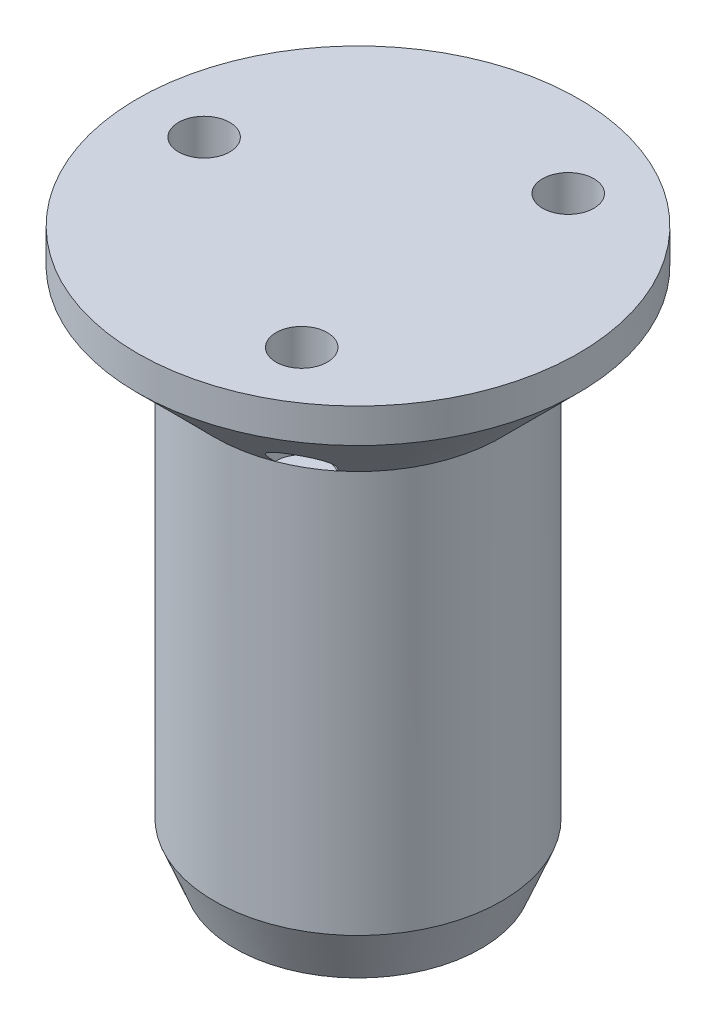
ISO-10303-21;
HEADER;
FILE_DESCRIPTION(('STEP AP214'),'2;1');
FILE_NAME('part.step','',(''),(''),'','','');
FILE_SCHEMA(('AUTOMOTIVE_DESIGN { 1 0 10303 214 1 1 1 1 }'));
ENDSEC;
DATA;
#1=APPLICATION_CONTEXT('core data for automotive mechanical design processes');
#2=APPLICATION_PROTOCOL_DEFINITION('international standard','automotive_design',2000,#1);
#3=PRODUCT_CONTEXT('',#1,'mechanical');
#4=PRODUCT('Part','Part','',(#3));
#5=PRODUCT_RELATED_PRODUCT_CATEGORY('part','',(#4));
#6=PRODUCT_DEFINITION_FORMATION('','',#4);
#7=PRODUCT_DEFINITION_CONTEXT('part definition',#1,'design');
#8=PRODUCT_DEFINITION('design','',#6,#7);
#9=PRODUCT_DEFINITION_SHAPE('','',#8);
#10=(LENGTH_UNIT() NAMED_UNIT(*) SI_UNIT(.MILLI.,.METRE.));
#11=(NAMED_UNIT(*) PLANE_ANGLE_UNIT() SI_UNIT($,.RADIAN.));
#12=(NAMED_UNIT(*) SI_UNIT($,.STERADIAN.) SOLID_ANGLE_UNIT());
#13=UNCERTAINTY_MEASURE_WITH_UNIT(LENGTH_MEASURE(1.E-05),#10,'distance_accuracy_value','');
#14=(GEOMETRIC_REPRESENTATION_CONTEXT(3) GLOBAL_UNCERTAINTY_ASSIGNED_CONTEXT((#13)) GLOBAL_UNIT_ASSIGNED_CONTEXT((#10,
#11,#12)) REPRESENTATION_CONTEXT('',''));
#15=CARTESIAN_POINT('',(0.,0.,0.));
#16=DIRECTION('',(0.,0.,1.));
#17=DIRECTION('',(1.,0.,0.));
#18=AXIS2_PLACEMENT_3D('',#15,#16,#17);
#19=CARTESIAN_POINT('',(0.,-2.,0.));
#20=DIRECTION('',(0.,1.,0.));
#21=DIRECTION('',(0.,0.,1.));
#22=AXIS2_PLACEMENT_3D('',#19,#20,#21);
#23=CYLINDRICAL_SURFACE('',#22,12.9);
#24=CARTESIAN_POINT('',(0.,-2.,0.));
#25=DIRECTION('',(0.,-1.,0.));
#26=DIRECTION('',(0.,0.,-1.));
#27=AXIS2_PLACEMENT_3D('',#24,#25,#26);
#28=CIRCLE('',#27,12.9);
#29=CARTESIAN_POINT('',(0.,-2.,-12.9));
#30=VERTEX_POINT('',#29);
#31=EDGE_CURVE('E104',#30,#30,#28,.T.);
#32=ORIENTED_EDGE('',*,*,#31,.F.);
#33=EDGE_LOOP('',(#32));
#34=FACE_BOUND('',#33,.T.);
#35=CARTESIAN_POINT('',(0.,0.,0.));
#36=DIRECTION('',(0.,1.,0.));
#37=DIRECTION('',(0.,0.,1.));
#38=AXIS2_PLACEMENT_3D('',#35,#36,#37);
#39=CIRCLE('',#38,12.9);
#40=CARTESIAN_POINT('',(0.,0.,12.9));
#41=VERTEX_POINT('',#40);
#42=EDGE_CURVE('E103',#41,#41,#39,.T.);
#43=ORIENTED_EDGE('',*,*,#42,.F.);
#44=EDGE_LOOP('',(#43));
#45=FACE_BOUND('',#44,.T.);
#46=ADVANCED_FACE('F32',(#34,#45),#23,.T.);
#47=CARTESIAN_POINT('',(0.,0.,0.));
#48=DIRECTION('',(0.,1.,0.));
#49=DIRECTION('',(0.,0.,1.));
#50=AXIS2_PLACEMENT_3D('',#47,#48,#49);
#51=PLANE('',#50);
#52=CARTESIAN_POINT('',(-9.,0.,0.));
#53=DIRECTION('',(0.,1.,0.));
#54=DIRECTION('',(0.,0.,1.));
#55=AXIS2_PLACEMENT_3D('',#52,#53,#54);
#56=CIRCLE('',#55,1.5);
#57=CARTESIAN_POINT('',(-9.,0.,1.5));
#58=VERTEX_POINT('',#57);
#59=EDGE_CURVE('E188',#58,#58,#56,.T.);
#60=ORIENTED_EDGE('',*,*,#59,.F.);
#61=EDGE_LOOP('',(#60));
#62=FACE_BOUND('',#61,.T.);
#63=CARTESIAN_POINT('',(4.50000000000003,0.,-7.79422863405993));
#64=DIRECTION('',(0.,1.,0.));
#65=DIRECTION('',(0.,0.,1.));
#66=AXIS2_PLACEMENT_3D('',#63,#64,#65);
#67=CIRCLE('',#66,1.5);
#68=CARTESIAN_POINT('',(4.50000000000003,0.,-6.29422863405993));
#69=VERTEX_POINT('',#68);
#70=EDGE_CURVE('E192',#69,#69,#67,.T.);
#71=ORIENTED_EDGE('',*,*,#70,.F.);
#72=EDGE_LOOP('',(#71));
#73=FACE_BOUND('',#72,.T.);
#74=CARTESIAN_POINT('',(4.50000000000004,0.,7.79422863405993));
#75=DIRECTION('',(0.,1.,0.));
#76=DIRECTION('',(0.,0.,1.));
#77=AXIS2_PLACEMENT_3D('',#74,#75,#76);
#78=CIRCLE('',#77,1.5);
#79=CARTESIAN_POINT('',(4.50000000000004,0.,9.29422863405992));
#80=VERTEX_POINT('',#79);
#81=EDGE_CURVE('E160',#80,#80,#78,.T.);
#82=ORIENTED_EDGE('',*,*,#81,.F.);
#83=EDGE_LOOP('',(#82));
#84=FACE_BOUND('',#83,.T.);
#85=ORIENTED_EDGE('',*,*,#42,.T.);
#86=EDGE_LOOP('',(#85));
#87=FACE_BOUND('',#86,.T.);
#88=ADVANCED_FACE('F177',(#62,#73,#84,#87),#51,.T.);
#89=CARTESIAN_POINT('',(0.,-2.,0.));
#90=DIRECTION('',(0.,1.,0.));
#91=DIRECTION('',(0.,0.,-1.));
#92=AXIS2_PLACEMENT_3D('',#89,#90,#91);
#93=CONICAL_SURFACE('',#92,12.9,0.78539816339745);
#94=CARTESIAN_POINT('',(0.,-6.5,0.));
#95=DIRECTION('',(0.,-1.,0.));
#96=DIRECTION('',(0.,0.,-1.));
#97=AXIS2_PLACEMENT_3D('',#94,#95,#96);
#98=CIRCLE('',#97,8.39999999999998);
#99=CARTESIAN_POINT('',(-8.29499999999998,-6.5,-1.32399962235643));
#100=VERTEX_POINT('',#99);
#101=CARTESIAN_POINT('',(3.00088269243835,-6.5,-7.8456805355701));
#102=VERTEX_POINT('',#101);
#103=EDGE_CURVE('E54',#100,#102,#98,.T.);
#104=ORIENTED_EDGE('',*,*,#103,.F.);
#105=CARTESIAN_POINT('',(-8.2948133355556,-6.50019999999994,-1.32390021085042));
#106=CARTESIAN_POINT('',(-8.34738668669859,-6.44386357180026,-1.35187811690227));
#107=CARTESIAN_POINT('',(-8.40106659626324,-6.38692104483049,-1.37647841384716));
#108=CARTESIAN_POINT('',(-8.51022908291239,-6.27229004671864,-1.41900417487351));
#109=CARTESIAN_POINT('',(-8.56571137647042,-6.21460169375106,-1.43693068330926));
#110=CARTESIAN_POINT('',(-8.6785090940311,-6.09849071165192,-1.46630844133853));
#111=CARTESIAN_POINT('',(-8.73583519535531,-6.04006582709039,-1.47770978211809));
#112=CARTESIAN_POINT('',(-8.85151275248889,-5.923327822058,-1.49377440670635));
#113=CARTESIAN_POINT('',(-8.90986427089606,-5.86501470865302,-1.49843727770076));
#114=CARTESIAN_POINT('',(-9.0863525365759,-5.69033756014666,-1.50214528840881));
#115=CARTESIAN_POINT('',(-9.2055447986388,-5.5746248501253,-1.49081099676006));
#116=CARTESIAN_POINT('',(-9.44232768546468,-5.34884448984281,-1.43839734316387));
#117=CARTESIAN_POINT('',(-9.55992231221007,-5.23875938345641,-1.39741679838285));
#118=CARTESIAN_POINT('',(-9.74779373160093,-5.0656232408859,-1.30293484555109));
#119=CARTESIAN_POINT('',(-9.82016438487202,-4.99964895860739,-1.2589085992467));
#120=CARTESIAN_POINT('',(-9.95957168287049,-4.87372316547325,-1.15615652962756));
#121=CARTESIAN_POINT('',(-10.026615557982,-4.81376346055842,-1.09745109657414));
#122=CARTESIAN_POINT('',(-10.1388823463932,-4.7141360859582,-0.978841720222277));
#123=CARTESIAN_POINT('',(-10.1857194662718,-4.67286026020672,-0.921824848308756));
#124=CARTESIAN_POINT('',(-10.2720730434249,-4.59714874235353,-0.7984239763528));
#125=CARTESIAN_POINT('',(-10.3115977041597,-4.56270538209891,-0.732050622016499));
#126=CARTESIAN_POINT('',(-10.3751342759961,-4.5075484751139,-0.602732589157478));
#127=CARTESIAN_POINT('',(-10.4006379141513,-4.48549935724348,-0.541094864489285));
#128=CARTESIAN_POINT('',(-10.4435857126607,-4.44845045202638,-0.413049763226484));
#129=CARTESIAN_POINT('',(-10.4610342359217,-4.43344684852883,-0.346644991191945));
#130=CARTESIAN_POINT('',(-10.4867882540994,-4.41132445613313,-0.210439068089613));
#131=CARTESIAN_POINT('',(-10.4950491351605,-4.40424414055211,-0.140623048061385));
#132=CARTESIAN_POINT('',(-10.5016447351282,-4.39858987616998,-0.000181248439347318));
#133=CARTESIAN_POINT('',(-10.499981789073,-4.40001392632459,0.0704443367636769));
#134=CARTESIAN_POINT('',(-10.4874154160623,-4.41079122923776,0.204309964785347));
#135=CARTESIAN_POINT('',(-10.4772837014413,-4.41948229989263,0.267679489268534));
#136=CARTESIAN_POINT('',(-10.4494211826802,-4.44343634124517,0.391409671325698));
#137=CARTESIAN_POINT('',(-10.4316899400441,-4.45869969116632,0.451770155052387));
#138=CARTESIAN_POINT('',(-10.3887262565994,-4.4957975947438,0.570608934440158));
#139=CARTESIAN_POINT('',(-10.3632175961048,-4.51787457014285,0.628910310152743));
#140=CARTESIAN_POINT('',(-10.3062348784891,-4.56738939276832,0.740039467923688));
#141=CARTESIAN_POINT('',(-10.2747573363883,-4.59483037210204,0.792864024287268));
#142=CARTESIAN_POINT('',(-10.192054935609,-4.66726794191557,0.914631658954378));
#143=CARTESIAN_POINT('',(-10.1382457856195,-4.71466774160586,0.980400168020199));
#144=CARTESIAN_POINT('',(-10.0237520822674,-4.81634305587925,1.09944725894165));
#145=CARTESIAN_POINT('',(-9.96305445557763,-4.87063166828094,1.15270148216723));
#146=CARTESIAN_POINT('',(-9.81674870613006,-5.00267168786804,1.26244861815542));
#147=CARTESIAN_POINT('',(-9.72944597149449,-5.08232230583112,1.31439049611742));
#148=CARTESIAN_POINT('',(-9.55092248117969,-5.2473601728877,1.39866252502382));
#149=CARTESIAN_POINT('',(-9.45969564429455,-5.33275645072566,1.43096096922569));
#150=CARTESIAN_POINT('',(-9.25268077871972,-5.52929146548514,1.48333169716938));
#151=CARTESIAN_POINT('',(-9.13654930835942,-5.64145165711855,1.49820228434191));
#152=CARTESIAN_POINT('',(-8.90631448681981,-5.8680290330749,1.50149148243465));
#153=CARTESIAN_POINT('',(-8.79221051249085,-5.98244550029744,1.48991836765634));
#154=CARTESIAN_POINT('',(-8.61405335879825,-6.16457748121705,1.45110057353249));
#155=CARTESIAN_POINT('',(-8.5483635483597,-6.23252868831872,1.43205250032285));
#156=CARTESIAN_POINT('',(-8.41956184430871,-6.36731683688022,1.38482914670905));
#157=CARTESIAN_POINT('',(-8.35644345026977,-6.43415629785294,1.3566787272371));
#158=CARTESIAN_POINT('',(-8.2948133355556,-6.50019999999994,1.32390021085042));
#159=B_SPLINE_CURVE_WITH_KNOTS('',3,(#105,#106,#107,#108,#109,#110,#111,#112,#113,#114,#115,
#116,#117,#118,#119,#120,#121,#122,#123,#124,#125,#126,#127,#128,#129,#130,#131,#132,#133,#134,
#135,#136,#137,#138,#139,#140,#141,#142,#143,#144,#145,#146,#147,#148,#149,#150,#151,#152,#153,
#154,#155,#156,#157,#158),.UNSPECIFIED.,.F.,.F.,(4,2,2,2,2,2,2,2,2,2,2,2,2,2,2,2,2,2,2,2,2,2,2,
2,2,2,4),(0.,0.245816724847092,0.491594966640196,0.739228788759014,0.986877780856484,
1.48381023270232,1.97909389195951,2.30015547920576,2.62077354651965,2.87348783389669,
3.12591687224672,3.33580899390305,3.54558729753524,3.75637986609703,3.96712283793918,
4.16052261255165,4.35393354791435,4.55522564985438,4.75663564171412,5.04692996451224,
5.33778473962407,5.72296900584317,6.10877336465988,6.59274017297387,7.0765555675835,
7.36536650428924,7.65339519171124),.UNSPECIFIED.);
#160=CARTESIAN_POINT('',(-8.29499999999998,-6.5,1.32399962235643));
#161=VERTEX_POINT('',#160);
#162=EDGE_CURVE('E84',#100,#161,#159,.T.);
#163=ORIENTED_EDGE('',*,*,#162,.T.);
#164=CARTESIAN_POINT('',(3.00088269243836,-6.5,7.8456805355701));
#165=VERTEX_POINT('',#164);
#166=EDGE_CURVE('E100',#165,#161,#98,.T.);
#167=ORIENTED_EDGE('',*,*,#166,.F.);
#168=CARTESIAN_POINT('',(3.0008754531058,-6.5002,7.84546917366621));
#169=CARTESIAN_POINT('',(3.00293255129169,-6.44386357180032,7.90498798434405));
#170=CARTESIAN_POINT('',(3.00846802397911,-6.38692104483055,7.96377629817233));
#171=CARTESIAN_POINT('',(3.02622087793959,-6.27229004671871,8.07957666526395));
#172=CARTESIAN_POINT('',(3.03843721301208,-6.21460169375113,8.1365889951633));
#173=CARTESIAN_POINT('',(3.06939418703284,-6.09849071165199,8.24896356307439));
#174=CARTESIAN_POINT('',(3.08818338694264,-6.04006582709046,8.30431009351086));
#175=CARTESIAN_POINT('',(3.13210979251373,-5.92332782205807,8.41252210893039));
#176=CARTESIAN_POINT('',(3.15724738698158,-5.86501470865309,8.46538744171761));
#177=CARTESIAN_POINT('',(3.24228028835082,-5.69033756014673,8.62008476862023));
#178=CARTESIAN_POINT('',(3.31169220388398,-5.57462485012537,8.71764114967685));
#179=CARTESIAN_POINT('',(3.47547520281637,-5.34884448984288,8.8964943180514));
#180=CARTESIAN_POINT('',(3.56976270903034,-5.23875938345648,8.97784397977095));
#181=CARTESIAN_POINT('',(3.74552219007724,-5.06562324088597,9.0933044251926));
#182=CARTESIAN_POINT('',(3.81983536444566,-4.99964895860745,9.13396612626165));
#183=CARTESIAN_POINT('',(3.97852491602649,-4.87372316547331,9.20332035299171));
#184=CARTESIAN_POINT('',(4.06288724994671,-4.81376346055847,9.23202933547977));
#185=CARTESIAN_POINT('',(4.22173937720003,-4.71413608595824,9.2699505380692));
#186=CARTESIAN_POINT('',(4.29453599666076,-4.67286026020676,9.28200423776741));
#187=CARTESIAN_POINT('',(4.44458107520031,-4.59714874235356,9.29508819331166));
#188=CARTESIAN_POINT('',(4.52182441655732,-4.56270538209894,9.29613087641579));
#189=CARTESIAN_POINT('',(4.66558540409891,-4.50754847511392,9.28649614526605));
#190=CARTESIAN_POINT('',(4.73171705857059,-4.4854993572435,9.27776408146322));
#191=CARTESIAN_POINT('',(4.86408126834904,-4.44845045202639,9.25093541537759));
#192=CARTESIAN_POINT('',(4.93031374949399,-4.43344684852885,9.2328438937629));
#193=CARTESIAN_POINT('',(5.06114854813536,-4.41132445613314,9.18704456620313));
#194=CARTESIAN_POINT('',(5.12574143560146,-4.40424414055211,9.15929068904555));
#195=CARTESIAN_POINT('',(5.25066540181124,-4.39858987616998,9.09478174635982));
#196=CARTESIAN_POINT('',(5.31099747972661,-4.40001392632459,9.05802880022939));
#197=CARTESIAN_POINT('',(5.42064532778157,-4.41079122923775,8.98021318795783));
#198=CARTESIAN_POINT('',(5.47045908849924,-4.41948229989262,8.93975410347055));
#199=CARTESIAN_POINT('',(5.56368130999506,-4.44343634124515,8.85375936338142));
#200=CARTESIAN_POINT('',(5.60708940096908,-4.45869969116631,8.8082234149546));
#201=CARTESIAN_POINT('',(5.68852496115128,-4.49579759474378,8.71159638395747));
#202=CARTESIAN_POINT('',(5.72626110334665,-4.51787457014284,8.66035454809631));
#203=CARTESIAN_POINT('',(5.79401041826962,-4.5673893927683,8.555441488179));
#204=CARTESIAN_POINT('',(5.82401905497372,-4.59483037210202,8.5017688588892));
#205=CARTESIAN_POINT('',(5.8881217195645,-4.66726794191555,8.36926266152676));
#206=CARTESIAN_POINT('',(5.91817434418979,-4.71466774160583,8.28977831614691));
#207=CARTESIAN_POINT('',(5.96402529749839,-4.81634305587921,8.13110031500996));
#208=CARTESIAN_POINT('',(5.97979599432564,-4.8706316682809,8.05190751673438));
#209=CARTESIAN_POINT('',(6.00168692736022,-5.002671687868,7.87032945299897));
#210=CARTESIAN_POINT('',(6.0030185458778,-5.08232230583107,7.76875212800371));
#211=CARTESIAN_POINT('',(5.98673851858181,-5.24736017288764,7.57201023576564));
#212=CARTESIAN_POINT('',(5.96909637332077,-5.3327564507256,7.47685625541527));
#213=CARTESIAN_POINT('',(5.91094332134729,-5.52929146548507,7.27139075889461));
#214=CARTESIAN_POINT('',(5.86575589242775,-5.64145165711848,7.16338266179748));
#215=CARTESIAN_POINT('',(5.75348701076434,-5.86802903307483,6.96234885846202));
#216=CARTESIAN_POINT('',(5.68641241220093,-5.98244550029736,6.86931847540953));
#217=CARTESIAN_POINT('',(5.5637166395245,-6.164577481217,6.73443875150772));
#218=CARTESIAN_POINT('',(5.51437561901251,-6.23252868831869,6.68707374350295));
#219=CARTESIAN_POINT('',(5.40907814310554,-6.36731683688024,6.59913987255094));
#220=CARTESIAN_POINT('',(5.35313996769615,-6.43415629785298,6.5585529496031));
#221=CARTESIAN_POINT('',(5.29393788244981,-6.5002,6.52156896281581));
#222=B_SPLINE_CURVE_WITH_KNOTS('',3,(#168,#169,#170,#171,#172,#173,#174,#175,#176,#177,#178,
#179,#180,#181,#182,#183,#184,#185,#186,#187,#188,#189,#190,#191,#192,#193,#194,#195,#196,#197,
#198,#199,#200,#201,#202,#203,#204,#205,#206,#207,#208,#209,#210,#211,#212,#213,#214,#215,#216,
#217,#218,#219,#220,#221),.UNSPECIFIED.,.F.,.F.,(4,2,2,2,2,2,2,2,2,2,2,2,2,2,2,2,2,2,2,2,2,2,2,
2,2,2,4),(0.,0.245816724847091,0.491594966640191,0.739228788759006,0.986877780856472,
1.48381023270231,1.97909389195949,2.30015547920575,2.62077354651966,2.8734878338967,
3.12591687224675,3.33580899390308,3.54558729753528,3.75637986609707,3.96712283793922,
4.16052261255169,4.35393354791439,4.55522564985442,4.75663564171416,5.04692996451228,
5.3377847396241,5.72296900584318,6.10877336465988,6.59274017297386,7.07655556758349,
7.36536650428933,7.65339519171143),.UNSPECIFIED.);
#223=CARTESIAN_POINT('',(5.2941173075617,-6.5,6.52168091321366));
#224=VERTEX_POINT('',#223);
#225=EDGE_CURVE('E110',#165,#224,#222,.T.);
#226=ORIENTED_EDGE('',*,*,#225,.T.);
#227=CARTESIAN_POINT('',(5.29411730756169,-6.5,-6.52168091321366));
#228=VERTEX_POINT('',#227);
#229=EDGE_CURVE('E101',#228,#224,#98,.T.);
#230=ORIENTED_EDGE('',*,*,#229,.F.);
#231=CARTESIAN_POINT('',(5.29393788244981,-6.5002,-6.52156896281582));
#232=CARTESIAN_POINT('',(5.34445413540691,-6.44386357180032,-6.5531098674418));
#233=CARTESIAN_POINT('',(5.39259857228414,-6.38692104483055,-6.58729788432519));
#234=CARTESIAN_POINT('',(5.48400820497281,-6.27229004671871,-6.66057249039045));
#235=CARTESIAN_POINT('',(5.52727416345834,-6.21460169375112,-6.69965831185405));
#236=CARTESIAN_POINT('',(5.60911490699826,-6.09849071165198,-6.78265512173587));
#237=CARTESIAN_POINT('',(5.64765180841268,-6.04006582709046,-6.82660031139277));
#238=CARTESIAN_POINT('',(5.71940295997516,-5.92332782205807,-6.91874770222404));
#239=CARTESIAN_POINT('',(5.75261688391448,-5.86501470865309,-6.96695016401684));
#240=CARTESIAN_POINT('',(5.84407224822508,-5.69033756014673,-7.11793948021141));
#241=CARTESIAN_POINT('',(5.89385259475482,-5.57462485012537,-7.22683015291678));
#242=CARTESIAN_POINT('',(5.96685248264831,-5.34884448984288,-7.4580969748875));
#243=CARTESIAN_POINT('',(5.99015960317973,-5.23875938345648,-7.58042718138806));
#244=CARTESIAN_POINT('',(6.0022715415237,-5.06562324088596,-7.79036957964146));
#245=CARTESIAN_POINT('',(6.00032902042638,-4.99964895860744,-7.8750575270149));
#246=CARTESIAN_POINT('',(5.98104676684402,-4.8737231654733,-8.0471638233641));
#247=CARTESIAN_POINT('',(5.96372830803537,-4.81376346055847,-8.13457823890558));
#248=CARTESIAN_POINT('',(5.91714296919321,-4.71413608595824,-8.29110881784687));
#249=CARTESIAN_POINT('',(5.89118346961109,-4.67286026020676,-8.3601793894586));
#250=CARTESIAN_POINT('',(5.82749196822462,-4.59714874235356,-8.4966642169588));
#251=CARTESIAN_POINT('',(5.78977328760239,-4.56270538209894,-8.56408025439923));
#252=CARTESIAN_POINT('',(5.70954887189729,-4.50754847511392,-8.68376355610851));
#253=CARTESIAN_POINT('',(5.66892085558073,-4.4854993572435,-8.73666921697387));
#254=CARTESIAN_POINT('',(5.5795044443117,-4.44845045202639,-8.83788565215104));
#255=CARTESIAN_POINT('',(5.5307204864278,-4.43344684852885,-8.8861989025709));
#256=CARTESIAN_POINT('',(5.42563970596411,-4.41132445613314,-8.97660549811346));
#257=CARTESIAN_POINT('',(5.36930769955908,-4.40424414055211,-9.01866764098411));
#258=CARTESIAN_POINT('',(5.25097933331707,-4.39858987616998,-9.09460049792042));
#259=CARTESIAN_POINT('',(5.18898430934652,-4.40001392632459,-9.12847313699302));
#260=CARTESIAN_POINT('',(5.06677008828083,-4.41079122923775,-9.18452315274313));
#261=CARTESIAN_POINT('',(5.00682461294214,-4.41948229989262,-9.20743359273904));
#262=CARTESIAN_POINT('',(4.8857398726852,-4.44343634124515,-9.24516903470707));
#263=CARTESIAN_POINT('',(4.82460053907515,-4.45869969116631,-9.25999357000694));
#264=CARTESIAN_POINT('',(4.70020129544827,-4.49579759474378,-9.28220531839759));
#265=CARTESIAN_POINT('',(4.63695649275827,-4.51787457014284,-9.28926485824901));
#266=CARTESIAN_POINT('',(4.51222446021963,-4.5673893927683,-9.29548095610265));
#267=CARTESIAN_POINT('',(4.45073828141472,-4.59483037210202,-9.29463288317644));
#268=CARTESIAN_POINT('',(4.30393321604458,-4.66726794191555,-9.28389432048111));
#269=CARTESIAN_POINT('',(4.22007144142981,-4.71466774160583,-9.27017848416708));
#270=CARTESIAN_POINT('',(4.05972678476918,-4.81634305587921,-9.2305475739516));
#271=CARTESIAN_POINT('',(3.98325846125212,-4.8706316682809,-9.20460899890158));
#272=CARTESIAN_POINT('',(3.81506177876997,-5.00267168786799,-9.13277807115437));
#273=CARTESIAN_POINT('',(3.72642742561682,-5.08232230583107,-9.08314262412112));
#274=CARTESIAN_POINT('',(3.56418396259803,-5.24736017288764,-8.97067276078945));
#275=CARTESIAN_POINT('',(3.49059927097392,-5.3327564507256,-8.90781722464096));
#276=CARTESIAN_POINT('',(3.34173745737258,-5.52929146548506,-8.754722456064));
#277=CARTESIAN_POINT('',(3.27079341593182,-5.64145165711848,-8.66158494613941));
#278=CARTESIAN_POINT('',(3.15282747605561,-5.86802903307482,-8.4638403408967));
#279=CARTESIAN_POINT('',(3.10579810029006,-5.98244550029735,-8.3592368430659));
#280=CARTESIAN_POINT('',(3.05033671927387,-6.16457748121699,-8.18553932504025));
#281=CARTESIAN_POINT('',(3.03398792934729,-6.23252868831868,-8.11912624382583));
#282=CARTESIAN_POINT('',(3.01048370120322,-6.36731683688024,-7.98396901926));
#283=CARTESIAN_POINT('',(3.00330348257365,-6.43415629785297,-7.9152316768402));
#284=CARTESIAN_POINT('',(3.0008754531058,-6.5002,-7.84546917366621));
#285=B_SPLINE_CURVE_WITH_KNOTS('',3,(#231,#232,#233,#234,#235,#236,#237,#238,#239,#240,#241,
#242,#243,#244,#245,#246,#247,#248,#249,#250,#251,#252,#253,#254,#255,#256,#257,#258,#259,#260,
#261,#262,#263,#264,#265,#266,#267,#268,#269,#270,#271,#272,#273,#274,#275,#276,#277,#278,#279,
#280,#281,#282,#283,#284),.UNSPECIFIED.,.F.,.F.,(4,2,2,2,2,2,2,2,2,2,2,2,2,2,2,2,2,2,2,2,2,2,2,
2,2,2,4),(0.,0.24581672484709,0.491594966640191,0.739228788759005,0.986877780856474,
1.48381023270231,1.97909389195949,2.30015547920575,2.62077354651966,2.8734878338967,
3.12591687224675,3.33580899390308,3.54558729753528,3.75637986609707,3.96712283793922,
4.16052261255169,4.35393354791439,4.55522564985442,4.75663564171415,5.04692996451227,
5.33778473962409,5.72296900584317,6.10877336465986,6.59274017297385,7.07655556758347,
7.36536650428932,7.65339519171142),.UNSPECIFIED.);
#286=EDGE_CURVE('E99',#228,#102,#285,.T.);
#287=ORIENTED_EDGE('',*,*,#286,.T.);
#288=EDGE_LOOP('',(#104,#163,#167,#226,#230,#287));
#289=FACE_BOUND('',#288,.T.);
#290=ORIENTED_EDGE('',*,*,#31,.T.);
#291=EDGE_LOOP('',(#290));
#292=FACE_BOUND('',#291,.T.);
#293=ADVANCED_FACE('F96',(#289,#292),#93,.T.);
#294=CARTESIAN_POINT('',(0.,-30.,0.));
#295=DIRECTION('',(0.,1.,0.));
#296=DIRECTION('',(0.,0.,1.));
#297=AXIS2_PLACEMENT_3D('',#294,#295,#296);
#298=CYLINDRICAL_SURFACE('',#297,8.39999999999998);
#299=CARTESIAN_POINT('',(0.,-30.,0.));
#300=DIRECTION('',(0.,-1.,0.));
#301=DIRECTION('',(0.,0.,-1.));
#302=AXIS2_PLACEMENT_3D('',#299,#300,#301);
#303=CIRCLE('',#302,8.39999999999998);
#304=CARTESIAN_POINT('',(0.,-30.,-8.39999999999998));
#305=VERTEX_POINT('',#304);
#306=EDGE_CURVE('E163',#305,#305,#303,.T.);
#307=ORIENTED_EDGE('',*,*,#306,.F.);
#308=EDGE_LOOP('',(#307));
#309=FACE_BOUND('',#308,.T.);
#310=ORIENTED_EDGE('',*,*,#166,.T.);
#311=DIRECTION('',(0.,1.,0.));
#312=VECTOR('',#311,1.);
#313=CARTESIAN_POINT('',(-8.29499999999998,-3.2505,1.32399962235643));
#314=LINE('',#313,#312);
#315=CARTESIAN_POINT('',(-8.29499999999998,-6.501,1.32399962235643));
#316=VERTEX_POINT('',#315);
#317=EDGE_CURVE('E11',#161,#316,#314,.F.);
#318=ORIENTED_EDGE('',*,*,#317,.T.);
#319=CARTESIAN_POINT('',(0.,-6.501,0.));
#320=DIRECTION('',(0.,-1.,0.));
#321=DIRECTION('',(0.,0.,-1.));
#322=AXIS2_PLACEMENT_3D('',#319,#320,#321);
#323=CIRCLE('',#322,8.39999999999998);
#324=CARTESIAN_POINT('',(-8.29499999999998,-6.501,-1.32399962235643));
#325=VERTEX_POINT('',#324);
#326=EDGE_CURVE('E41',#316,#325,#323,.T.);
#327=ORIENTED_EDGE('',*,*,#326,.T.);
#328=DIRECTION('',(0.,1.,0.));
#329=VECTOR('',#328,1.);
#330=CARTESIAN_POINT('',(-8.29499999999998,-3.2505,-1.32399962235643));
#331=LINE('',#330,#329);
#332=EDGE_CURVE('E36',#325,#100,#331,.T.);
#333=ORIENTED_EDGE('',*,*,#332,.T.);
#334=ORIENTED_EDGE('',*,*,#103,.T.);
#335=DIRECTION('',(0.,1.,0.));
#336=VECTOR('',#335,1.);
#337=CARTESIAN_POINT('',(3.00088269243835,-3.2505,-7.8456805355701));
#338=LINE('',#337,#336);
#339=CARTESIAN_POINT('',(3.00088269243835,-6.501,-7.8456805355701));
#340=VERTEX_POINT('',#339);
#341=EDGE_CURVE('E91',#102,#340,#338,.F.);
#342=ORIENTED_EDGE('',*,*,#341,.T.);
#343=CARTESIAN_POINT('',(0.,-6.501,0.));
#344=DIRECTION('',(0.,-1.,0.));
#345=DIRECTION('',(0.,0.,-1.));
#346=AXIS2_PLACEMENT_3D('',#343,#344,#345);
#347=CIRCLE('',#346,8.39999999999998);
#348=CARTESIAN_POINT('',(5.29411730756169,-6.501,-6.52168091321366));
#349=VERTEX_POINT('',#348);
#350=EDGE_CURVE('E135',#340,#349,#347,.T.);
#351=ORIENTED_EDGE('',*,*,#350,.T.);
#352=DIRECTION('',(0.,1.,0.));
#353=VECTOR('',#352,1.);
#354=CARTESIAN_POINT('',(5.29411730756169,-3.2505,-6.52168091321366));
#355=LINE('',#354,#353);
#356=EDGE_CURVE('E133',#349,#228,#355,.T.);
#357=ORIENTED_EDGE('',*,*,#356,.T.);
#358=ORIENTED_EDGE('',*,*,#229,.T.);
#359=DIRECTION('',(0.,1.,0.));
#360=VECTOR('',#359,1.);
#361=CARTESIAN_POINT('',(5.2941173075617,-3.2505,6.52168091321366));
#362=LINE('',#361,#360);
#363=CARTESIAN_POINT('',(5.2941173075617,-6.501,6.52168091321366));
#364=VERTEX_POINT('',#363);
#365=EDGE_CURVE('E134',#224,#364,#362,.F.);
#366=ORIENTED_EDGE('',*,*,#365,.T.);
#367=CARTESIAN_POINT('',(0.,-6.501,0.));
#368=DIRECTION('',(0.,-1.,0.));
#369=DIRECTION('',(0.,0.,-1.));
#370=AXIS2_PLACEMENT_3D('',#367,#368,#369);
#371=CIRCLE('',#370,8.39999999999998);
#372=CARTESIAN_POINT('',(3.00088269243836,-6.501,7.8456805355701));
#373=VERTEX_POINT('',#372);
#374=EDGE_CURVE('E119',#364,#373,#371,.T.);
#375=ORIENTED_EDGE('',*,*,#374,.T.);
#376=DIRECTION('',(0.,1.,0.));
#377=VECTOR('',#376,1.);
#378=CARTESIAN_POINT('',(3.00088269243836,-3.2505,7.8456805355701));
#379=LINE('',#378,#377);
#380=EDGE_CURVE('E118',#373,#165,#379,.T.);
#381=ORIENTED_EDGE('',*,*,#380,.T.);
#382=EDGE_LOOP('',(#310,#318,#327,#333,#334,#342,#351,#357,#358,#366,#375,#381));
#383=FACE_BOUND('',#382,.T.);
#384=ADVANCED_FACE('F94',(#309,#383),#298,.T.);
#385=CARTESIAN_POINT('',(0.,-30.,0.));
#386=DIRECTION('',(0.,1.,0.));
#387=DIRECTION('',(0.,0.,-1.));
#388=AXIS2_PLACEMENT_3D('',#385,#386,#387);
#389=CONICAL_SURFACE('',#388,8.39999999999998,0.380481776934765);
#390=CARTESIAN_POINT('',(0.,-33.,0.));
#391=DIRECTION('',(0.,-1.,0.));
#392=DIRECTION('',(0.,0.,-1.));
#393=AXIS2_PLACEMENT_3D('',#390,#391,#392);
#394=CIRCLE('',#393,7.20008560777566);
#395=CARTESIAN_POINT('',(0.,-33.,-7.20008560777566));
#396=VERTEX_POINT('',#395);
#397=EDGE_CURVE('E159',#396,#396,#394,.T.);
#398=ORIENTED_EDGE('',*,*,#397,.F.);
#399=EDGE_LOOP('',(#398));
#400=FACE_BOUND('',#399,.T.);
#401=ORIENTED_EDGE('',*,*,#306,.T.);
#402=EDGE_LOOP('',(#401));
#403=FACE_BOUND('',#402,.T.);
#404=ADVANCED_FACE('F210',(#400,#403),#389,.T.);
#405=CARTESIAN_POINT('',(0.,-33.,0.));
#406=DIRECTION('',(0.,-1.,0.));
#407=DIRECTION('',(0.,0.,-1.));
#408=AXIS2_PLACEMENT_3D('',#405,#406,#407);
#409=PLANE('',#408);
#410=ORIENTED_EDGE('',*,*,#397,.T.);
#411=EDGE_LOOP('',(#410));
#412=FACE_BOUND('',#411,.T.);
#413=ADVANCED_FACE('F204',(#412),#409,.T.);
#414=CARTESIAN_POINT('',(4.50000000000004,-6.501,7.79422863405993));
#415=DIRECTION('',(0.,-1.,0.));
#416=DIRECTION('',(0.,0.,-1.));
#417=AXIS2_PLACEMENT_3D('',#414,#415,#416);
#418=PLANE('',#417);
#419=CARTESIAN_POINT('',(4.50000000000004,-6.501,7.79422863405993));
#420=DIRECTION('',(0.,1.,0.));
#421=DIRECTION('',(0.,0.,1.));
#422=AXIS2_PLACEMENT_3D('',#419,#420,#421);
#423=CIRCLE('',#422,1.5);
#424=EDGE_CURVE('E158',#364,#373,#423,.T.);
#425=ORIENTED_EDGE('',*,*,#424,.T.);
#426=ORIENTED_EDGE('',*,*,#374,.F.);
#427=EDGE_LOOP('',(#425,#426));
#428=FACE_BOUND('',#427,.T.);
#429=ADVANCED_FACE('F157',(#428),#418,.F.);
#430=CARTESIAN_POINT('',(4.50000000000004,0.,7.79422863405993));
#431=DIRECTION('',(0.,1.,0.));
#432=DIRECTION('',(0.,0.,1.));
#433=AXIS2_PLACEMENT_3D('',#430,#431,#432);
#434=CYLINDRICAL_SURFACE('',#433,1.5);
#435=ORIENTED_EDGE('',*,*,#225,.F.);
#436=ORIENTED_EDGE('',*,*,#380,.F.);
#437=ORIENTED_EDGE('',*,*,#424,.F.);
#438=ORIENTED_EDGE('',*,*,#365,.F.);
#439=EDGE_LOOP('',(#435,#436,#437,#438));
#440=FACE_BOUND('',#439,.T.);
#441=ORIENTED_EDGE('',*,*,#81,.T.);
#442=EDGE_LOOP('',(#441));
#443=FACE_BOUND('',#442,.T.);
#444=ADVANCED_FACE('F151',(#440,#443),#434,.F.);
#445=CARTESIAN_POINT('',(4.50000000000003,-6.501,-7.79422863405993));
#446=DIRECTION('',(0.,-1.,0.));
#447=DIRECTION('',(0.,0.,-1.));
#448=AXIS2_PLACEMENT_3D('',#445,#446,#447);
#449=PLANE('',#448);
#450=CARTESIAN_POINT('',(4.50000000000003,-6.501,-7.79422863405993));
#451=DIRECTION('',(0.,1.,0.));
#452=DIRECTION('',(0.,0.,1.));
#453=AXIS2_PLACEMENT_3D('',#450,#451,#452);
#454=CIRCLE('',#453,1.5);
#455=EDGE_CURVE('E166',#340,#349,#454,.T.);
#456=ORIENTED_EDGE('',*,*,#455,.T.);
#457=ORIENTED_EDGE('',*,*,#350,.F.);
#458=EDGE_LOOP('',(#456,#457));
#459=FACE_BOUND('',#458,.T.);
#460=ADVANCED_FACE('F195',(#459),#449,.F.);
#461=CARTESIAN_POINT('',(4.50000000000003,0.,-7.79422863405993));
#462=DIRECTION('',(0.,1.,0.));
#463=DIRECTION('',(0.,0.,1.));
#464=AXIS2_PLACEMENT_3D('',#461,#462,#463);
#465=CYLINDRICAL_SURFACE('',#464,1.5);
#466=ORIENTED_EDGE('',*,*,#286,.F.);
#467=ORIENTED_EDGE('',*,*,#356,.F.);
#468=ORIENTED_EDGE('',*,*,#455,.F.);
#469=ORIENTED_EDGE('',*,*,#341,.F.);
#470=EDGE_LOOP('',(#466,#467,#468,#469));
#471=FACE_BOUND('',#470,.T.);
#472=ORIENTED_EDGE('',*,*,#70,.T.);
#473=EDGE_LOOP('',(#472));
#474=FACE_BOUND('',#473,.T.);
#475=ADVANCED_FACE('F201',(#471,#474),#465,.F.);
#476=CARTESIAN_POINT('',(-9.,-6.501,0.));
#477=DIRECTION('',(0.,-1.,0.));
#478=DIRECTION('',(0.,0.,-1.));
#479=AXIS2_PLACEMENT_3D('',#476,#477,#478);
#480=PLANE('',#479);
#481=CARTESIAN_POINT('',(-9.,-6.501,0.));
#482=DIRECTION('',(0.,1.,0.));
#483=DIRECTION('',(0.,0.,1.));
#484=AXIS2_PLACEMENT_3D('',#481,#482,#483);
#485=CIRCLE('',#484,1.5);
#486=EDGE_CURVE('E272',#316,#325,#485,.T.);
#487=ORIENTED_EDGE('',*,*,#486,.T.);
#488=ORIENTED_EDGE('',*,*,#326,.F.);
#489=EDGE_LOOP('',(#487,#488));
#490=FACE_BOUND('',#489,.T.);
#491=ADVANCED_FACE('F252',(#490),#480,.F.);
#492=CARTESIAN_POINT('',(-9.,0.,0.));
#493=DIRECTION('',(0.,1.,0.));
#494=DIRECTION('',(0.,0.,1.));
#495=AXIS2_PLACEMENT_3D('',#492,#493,#494);
#496=CYLINDRICAL_SURFACE('',#495,1.5);
#497=ORIENTED_EDGE('',*,*,#162,.F.);
#498=ORIENTED_EDGE('',*,*,#332,.F.);
#499=ORIENTED_EDGE('',*,*,#486,.F.);
#500=ORIENTED_EDGE('',*,*,#317,.F.);
#501=EDGE_LOOP('',(#497,#498,#499,#500));
#502=FACE_BOUND('',#501,.T.);
#503=ORIENTED_EDGE('',*,*,#59,.T.);
#504=EDGE_LOOP('',(#503));
#505=FACE_BOUND('',#504,.T.);
#506=ADVANCED_FACE('F85',(#502,#505),#496,.F.);
#507=CLOSED_SHELL('',(#46,#88,#293,#384,#404,#413,#429,#444,#460,#475,#491,#506));
#508=MANIFOLD_SOLID_BREP('B2',#507);
#509=ADVANCED_BREP_SHAPE_REPRESENTATION('',(#18,#508),#14);
#510=SHAPE_DEFINITION_REPRESENTATION(#9,#509);
ENDSEC;
END-ISO-10303-21;
